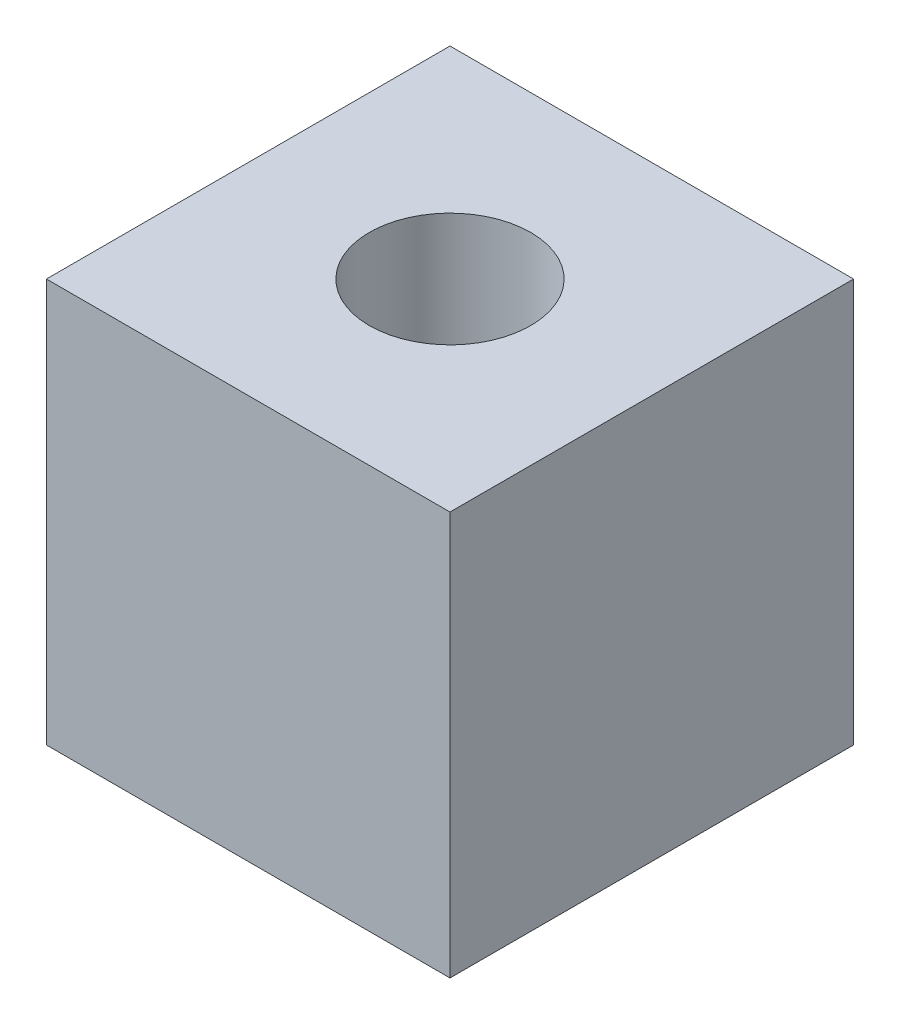
ISO-10303-21;
HEADER;
FILE_DESCRIPTION(('STEP AP214'),'2;1');
FILE_NAME('part.step','',(''),(''),'','','');
FILE_SCHEMA(('AUTOMOTIVE_DESIGN { 1 0 10303 214 1 1 1 1 }'));
ENDSEC;
DATA;
#1=APPLICATION_CONTEXT('core data for automotive mechanical design processes');
#2=APPLICATION_PROTOCOL_DEFINITION('international standard','automotive_design',2000,#1);
#3=PRODUCT_CONTEXT('',#1,'mechanical');
#4=PRODUCT('Part','Part','',(#3));
#5=PRODUCT_RELATED_PRODUCT_CATEGORY('part','',(#4));
#6=PRODUCT_DEFINITION_FORMATION('','',#4);
#7=PRODUCT_DEFINITION_CONTEXT('part definition',#1,'design');
#8=PRODUCT_DEFINITION('design','',#6,#7);
#9=PRODUCT_DEFINITION_SHAPE('','',#8);
#10=(LENGTH_UNIT() NAMED_UNIT(*) SI_UNIT(.MILLI.,.METRE.));
#11=(NAMED_UNIT(*) PLANE_ANGLE_UNIT() SI_UNIT($,.RADIAN.));
#12=(NAMED_UNIT(*) SI_UNIT($,.STERADIAN.) SOLID_ANGLE_UNIT());
#13=UNCERTAINTY_MEASURE_WITH_UNIT(LENGTH_MEASURE(1.E-05),#10,'distance_accuracy_value','');
#14=(GEOMETRIC_REPRESENTATION_CONTEXT(3) GLOBAL_UNCERTAINTY_ASSIGNED_CONTEXT((#13)) GLOBAL_UNIT_ASSIGNED_CONTEXT((#10,
#11,#12)) REPRESENTATION_CONTEXT('',''));
#15=CARTESIAN_POINT('',(0.,0.,0.));
#16=DIRECTION('',(0.,0.,1.));
#17=DIRECTION('',(1.,0.,0.));
#18=AXIS2_PLACEMENT_3D('',#15,#16,#17);
#19=CARTESIAN_POINT('',(0.,50.,0.));
#20=DIRECTION('',(0.,1.,0.));
#21=DIRECTION('',(0.,0.,1.));
#22=AXIS2_PLACEMENT_3D('',#19,#20,#21);
#23=PLANE('',#22);
#24=DIRECTION('',(0.,0.,-1.));
#25=VECTOR('',#24,1.);
#26=CARTESIAN_POINT('',(25.,50.,-25.));
#27=LINE('',#26,#25);
#28=CARTESIAN_POINT('',(25.,50.,25.));
#29=VERTEX_POINT('',#28);
#30=CARTESIAN_POINT('',(25.,50.,-25.));
#31=VERTEX_POINT('',#30);
#32=EDGE_CURVE('E85',#29,#31,#27,.T.);
#33=ORIENTED_EDGE('',*,*,#32,.T.);
#34=DIRECTION('',(-1.,0.,0.));
#35=VECTOR('',#34,1.);
#36=CARTESIAN_POINT('',(-25.,50.,-25.));
#37=LINE('',#36,#35);
#38=CARTESIAN_POINT('',(-25.,50.,-25.));
#39=VERTEX_POINT('',#38);
#40=EDGE_CURVE('E80',#31,#39,#37,.T.);
#41=ORIENTED_EDGE('',*,*,#40,.T.);
#42=DIRECTION('',(0.,0.,1.));
#43=VECTOR('',#42,1.);
#44=CARTESIAN_POINT('',(-25.,50.,-25.));
#45=LINE('',#44,#43);
#46=CARTESIAN_POINT('',(-25.,50.,25.));
#47=VERTEX_POINT('',#46);
#48=EDGE_CURVE('E83',#39,#47,#45,.T.);
#49=ORIENTED_EDGE('',*,*,#48,.T.);
#50=DIRECTION('',(1.,0.,0.));
#51=VECTOR('',#50,1.);
#52=CARTESIAN_POINT('',(-25.,50.,25.));
#53=LINE('',#52,#51);
#54=EDGE_CURVE('E50',#47,#29,#53,.T.);
#55=ORIENTED_EDGE('',*,*,#54,.T.);
#56=EDGE_LOOP('',(#33,#41,#49,#55));
#57=FACE_BOUND('',#56,.T.);
#58=CARTESIAN_POINT('',(0.,50.,0.));
#59=DIRECTION('',(0.,1.,0.));
#60=DIRECTION('',(0.,0.,1.));
#61=AXIS2_PLACEMENT_3D('',#58,#59,#60);
#62=CIRCLE('',#61,10.);
#63=CARTESIAN_POINT('',(0.,50.,9.99999999999999));
#64=VERTEX_POINT('',#63);
#65=EDGE_CURVE('E100',#64,#64,#62,.T.);
#66=ORIENTED_EDGE('',*,*,#65,.F.);
#67=EDGE_LOOP('',(#66));
#68=FACE_BOUND('',#67,.T.);
#69=ADVANCED_FACE('F33',(#57,#68),#23,.T.);
#70=CARTESIAN_POINT('',(0.,0.,0.));
#71=DIRECTION('',(0.,1.,0.));
#72=DIRECTION('',(0.,0.,1.));
#73=AXIS2_PLACEMENT_3D('',#70,#71,#72);
#74=PLANE('',#73);
#75=DIRECTION('',(0.,0.,-1.));
#76=VECTOR('',#75,1.);
#77=CARTESIAN_POINT('',(25.,0.,-25.));
#78=LINE('',#77,#76);
#79=CARTESIAN_POINT('',(25.,0.,25.));
#80=VERTEX_POINT('',#79);
#81=CARTESIAN_POINT('',(25.,0.,-25.));
#82=VERTEX_POINT('',#81);
#83=EDGE_CURVE('E97',#80,#82,#78,.T.);
#84=ORIENTED_EDGE('',*,*,#83,.F.);
#85=DIRECTION('',(1.,0.,0.));
#86=VECTOR('',#85,1.);
#87=CARTESIAN_POINT('',(-25.,0.,25.));
#88=LINE('',#87,#86);
#89=CARTESIAN_POINT('',(-25.,0.,25.));
#90=VERTEX_POINT('',#89);
#91=EDGE_CURVE('E73',#90,#80,#88,.T.);
#92=ORIENTED_EDGE('',*,*,#91,.F.);
#93=DIRECTION('',(0.,0.,1.));
#94=VECTOR('',#93,1.);
#95=CARTESIAN_POINT('',(-25.,0.,-25.));
#96=LINE('',#95,#94);
#97=CARTESIAN_POINT('',(-25.,0.,-25.));
#98=VERTEX_POINT('',#97);
#99=EDGE_CURVE('E67',#98,#90,#96,.T.);
#100=ORIENTED_EDGE('',*,*,#99,.F.);
#101=DIRECTION('',(-1.,0.,0.));
#102=VECTOR('',#101,1.);
#103=CARTESIAN_POINT('',(-25.,0.,-25.));
#104=LINE('',#103,#102);
#105=EDGE_CURVE('E89',#82,#98,#104,.T.);
#106=ORIENTED_EDGE('',*,*,#105,.F.);
#107=EDGE_LOOP('',(#84,#92,#100,#106));
#108=FACE_BOUND('',#107,.T.);
#109=CARTESIAN_POINT('',(0.,0.,0.));
#110=DIRECTION('',(0.,1.,0.));
#111=DIRECTION('',(0.,0.,1.));
#112=AXIS2_PLACEMENT_3D('',#109,#110,#111);
#113=CIRCLE('',#112,10.);
#114=CARTESIAN_POINT('',(0.,0.,9.99999999999999));
#115=VERTEX_POINT('',#114);
#116=EDGE_CURVE('E112',#115,#115,#113,.T.);
#117=ORIENTED_EDGE('',*,*,#116,.T.);
#118=EDGE_LOOP('',(#117));
#119=FACE_BOUND('',#118,.T.);
#120=ADVANCED_FACE('F108',(#108,#119),#74,.F.);
#121=CARTESIAN_POINT('',(25.,50.,-25.));
#122=DIRECTION('',(-1.,0.,0.));
#123=DIRECTION('',(0.,0.,1.));
#124=AXIS2_PLACEMENT_3D('',#121,#122,#123);
#125=PLANE('',#124);
#126=ORIENTED_EDGE('',*,*,#83,.T.);
#127=DIRECTION('',(0.,-1.,0.));
#128=VECTOR('',#127,1.);
#129=CARTESIAN_POINT('',(25.,50.,-25.));
#130=LINE('',#129,#128);
#131=EDGE_CURVE('E11',#31,#82,#130,.T.);
#132=ORIENTED_EDGE('',*,*,#131,.F.);
#133=ORIENTED_EDGE('',*,*,#32,.F.);
#134=DIRECTION('',(0.,-1.,0.));
#135=VECTOR('',#134,1.);
#136=CARTESIAN_POINT('',(25.,50.,25.));
#137=LINE('',#136,#135);
#138=EDGE_CURVE('E93',#29,#80,#137,.T.);
#139=ORIENTED_EDGE('',*,*,#138,.T.);
#140=EDGE_LOOP('',(#126,#132,#133,#139));
#141=FACE_BOUND('',#140,.T.);
#142=ADVANCED_FACE('F35',(#141),#125,.F.);
#143=CARTESIAN_POINT('',(-25.,50.,-25.));
#144=DIRECTION('',(0.,0.,1.));
#145=DIRECTION('',(1.,0.,0.));
#146=AXIS2_PLACEMENT_3D('',#143,#144,#145);
#147=PLANE('',#146);
#148=ORIENTED_EDGE('',*,*,#105,.T.);
#149=DIRECTION('',(0.,-1.,0.));
#150=VECTOR('',#149,1.);
#151=CARTESIAN_POINT('',(-25.,50.,-25.));
#152=LINE('',#151,#150);
#153=EDGE_CURVE('E42',#39,#98,#152,.T.);
#154=ORIENTED_EDGE('',*,*,#153,.F.);
#155=ORIENTED_EDGE('',*,*,#40,.F.);
#156=ORIENTED_EDGE('',*,*,#131,.T.);
#157=EDGE_LOOP('',(#148,#154,#155,#156));
#158=FACE_BOUND('',#157,.T.);
#159=ADVANCED_FACE('F88',(#158),#147,.F.);
#160=CARTESIAN_POINT('',(-25.,50.,-25.));
#161=DIRECTION('',(1.,0.,0.));
#162=DIRECTION('',(0.,0.,-1.));
#163=AXIS2_PLACEMENT_3D('',#160,#161,#162);
#164=PLANE('',#163);
#165=ORIENTED_EDGE('',*,*,#99,.T.);
#166=DIRECTION('',(0.,-1.,0.));
#167=VECTOR('',#166,1.);
#168=CARTESIAN_POINT('',(-25.,50.,25.));
#169=LINE('',#168,#167);
#170=EDGE_CURVE('E90',#47,#90,#169,.T.);
#171=ORIENTED_EDGE('',*,*,#170,.F.);
#172=ORIENTED_EDGE('',*,*,#48,.F.);
#173=ORIENTED_EDGE('',*,*,#153,.T.);
#174=EDGE_LOOP('',(#165,#171,#172,#173));
#175=FACE_BOUND('',#174,.T.);
#176=ADVANCED_FACE('F91',(#175),#164,.F.);
#177=CARTESIAN_POINT('',(-25.,50.,25.));
#178=DIRECTION('',(0.,0.,-1.));
#179=DIRECTION('',(-1.,0.,0.));
#180=AXIS2_PLACEMENT_3D('',#177,#178,#179);
#181=PLANE('',#180);
#182=ORIENTED_EDGE('',*,*,#91,.T.);
#183=ORIENTED_EDGE('',*,*,#138,.F.);
#184=ORIENTED_EDGE('',*,*,#54,.F.);
#185=ORIENTED_EDGE('',*,*,#170,.T.);
#186=EDGE_LOOP('',(#182,#183,#184,#185));
#187=FACE_BOUND('',#186,.T.);
#188=ADVANCED_FACE('F105',(#187),#181,.F.);
#189=CARTESIAN_POINT('',(0.,50.,0.));
#190=DIRECTION('',(0.,-1.,0.));
#191=DIRECTION('',(0.,0.,-1.));
#192=AXIS2_PLACEMENT_3D('',#189,#190,#191);
#193=CYLINDRICAL_SURFACE('',#192,10.);
#194=ORIENTED_EDGE('',*,*,#65,.T.);
#195=EDGE_LOOP('',(#194));
#196=FACE_BOUND('',#195,.T.);
#197=ORIENTED_EDGE('',*,*,#116,.F.);
#198=EDGE_LOOP('',(#197));
#199=FACE_BOUND('',#198,.T.);
#200=ADVANCED_FACE('F118',(#196,#199),#193,.F.);
#201=CLOSED_SHELL('',(#69,#120,#142,#159,#176,#188,#200));
#202=MANIFOLD_SOLID_BREP('B2',#201);
#203=ADVANCED_BREP_SHAPE_REPRESENTATION('',(#18,#202),#14);
#204=SHAPE_DEFINITION_REPRESENTATION(#9,#203);
ENDSEC;
END-ISO-10303-21;
